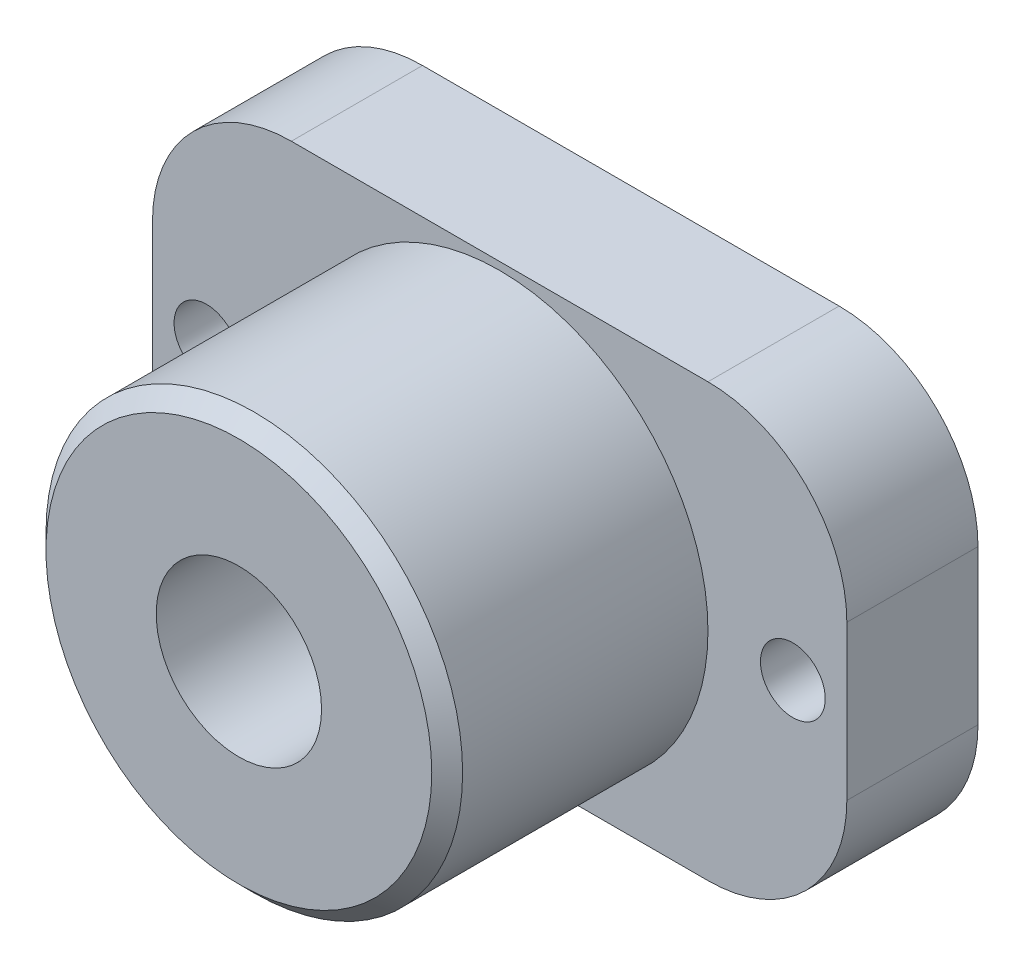
ISO-10303-21;
HEADER;
FILE_DESCRIPTION(('STEP AP214'),'2;1');
FILE_NAME('part.step','',(''),(''),'','','');
FILE_SCHEMA(('AUTOMOTIVE_DESIGN { 1 0 10303 214 1 1 1 1 }'));
ENDSEC;
DATA;
#1=APPLICATION_CONTEXT('core data for automotive mechanical design processes');
#2=APPLICATION_PROTOCOL_DEFINITION('international standard','automotive_design',2000,#1);
#3=PRODUCT_CONTEXT('',#1,'mechanical');
#4=PRODUCT('Part','Part','',(#3));
#5=PRODUCT_RELATED_PRODUCT_CATEGORY('part','',(#4));
#6=PRODUCT_DEFINITION_FORMATION('','',#4);
#7=PRODUCT_DEFINITION_CONTEXT('part definition',#1,'design');
#8=PRODUCT_DEFINITION('design','',#6,#7);
#9=PRODUCT_DEFINITION_SHAPE('','',#8);
#10=(LENGTH_UNIT() NAMED_UNIT(*) SI_UNIT(.MILLI.,.METRE.));
#11=(NAMED_UNIT(*) PLANE_ANGLE_UNIT() SI_UNIT($,.RADIAN.));
#12=(NAMED_UNIT(*) SI_UNIT($,.STERADIAN.) SOLID_ANGLE_UNIT());
#13=UNCERTAINTY_MEASURE_WITH_UNIT(LENGTH_MEASURE(1.E-05),#10,'distance_accuracy_value','');
#14=(GEOMETRIC_REPRESENTATION_CONTEXT(3) GLOBAL_UNCERTAINTY_ASSIGNED_CONTEXT((#13)) GLOBAL_UNIT_ASSIGNED_CONTEXT((#10,
#11,#12)) REPRESENTATION_CONTEXT('',''));
#15=CARTESIAN_POINT('',(0.,0.,0.));
#16=DIRECTION('',(0.,0.,1.));
#17=DIRECTION('',(1.,0.,0.));
#18=AXIS2_PLACEMENT_3D('',#15,#16,#17);
#19=CARTESIAN_POINT('',(0.,0.,0.));
#20=DIRECTION('',(0.,0.,1.));
#21=DIRECTION('',(1.,0.,0.));
#22=AXIS2_PLACEMENT_3D('',#19,#20,#21);
#23=CYLINDRICAL_SURFACE('',#22,5.35813);
#24=CARTESIAN_POINT('',(0.,0.,0.));
#25=DIRECTION('',(0.,0.,1.));
#26=DIRECTION('',(1.,0.,0.));
#27=AXIS2_PLACEMENT_3D('',#24,#25,#26);
#28=CIRCLE('',#27,5.35813);
#29=CARTESIAN_POINT('',(5.35813,0.,0.));
#30=VERTEX_POINT('',#29);
#31=EDGE_CURVE('E128',#30,#30,#28,.T.);
#32=ORIENTED_EDGE('',*,*,#31,.T.);
#33=EDGE_LOOP('',(#32));
#34=FACE_BOUND('',#33,.T.);
#35=CARTESIAN_POINT('',(0.,0.,-13.4));
#36=DIRECTION('',(0.,0.,-1.));
#37=DIRECTION('',(-1.,0.,0.));
#38=AXIS2_PLACEMENT_3D('',#35,#36,#37);
#39=CIRCLE('',#38,5.35813);
#40=CARTESIAN_POINT('',(-5.35813,0.,-13.4));
#41=VERTEX_POINT('',#40);
#42=EDGE_CURVE('E38',#41,#41,#39,.F.);
#43=ORIENTED_EDGE('',*,*,#42,.F.);
#44=EDGE_LOOP('',(#43));
#45=FACE_BOUND('',#44,.T.);
#46=ADVANCED_FACE('F34',(#34,#45),#23,.F.);
#47=CARTESIAN_POINT('',(0.,0.,0.));
#48=DIRECTION('',(0.,0.,1.));
#49=DIRECTION('',(1.,0.,0.));
#50=AXIS2_PLACEMENT_3D('',#47,#48,#49);
#51=PLANE('',#50);
#52=CARTESIAN_POINT('',(0.,0.,0.));
#53=DIRECTION('',(0.,0.,1.));
#54=DIRECTION('',(1.,0.,0.));
#55=AXIS2_PLACEMENT_3D('',#52,#53,#54);
#56=CIRCLE('',#55,12.5);
#57=CARTESIAN_POINT('',(12.5,0.,0.));
#58=VERTEX_POINT('',#57);
#59=EDGE_CURVE('E11',#58,#58,#56,.T.);
#60=ORIENTED_EDGE('',*,*,#59,.T.);
#61=EDGE_LOOP('',(#60));
#62=FACE_BOUND('',#61,.T.);
#63=ORIENTED_EDGE('',*,*,#31,.F.);
#64=EDGE_LOOP('',(#63));
#65=FACE_BOUND('',#64,.T.);
#66=ADVANCED_FACE('F176',(#62,#65),#51,.T.);
#67=CARTESIAN_POINT('',(0.,0.,0.));
#68=DIRECTION('',(0.,0.,-1.));
#69=DIRECTION('',(-1.,0.,0.));
#70=AXIS2_PLACEMENT_3D('',#67,#68,#69);
#71=CYLINDRICAL_SURFACE('',#70,13.5);
#72=CARTESIAN_POINT('',(0.,0.,-1.00000000000001));
#73=DIRECTION('',(0.,0.,1.));
#74=DIRECTION('',(1.,0.,0.));
#75=AXIS2_PLACEMENT_3D('',#72,#73,#74);
#76=CIRCLE('',#75,13.5);
#77=CARTESIAN_POINT('',(13.5,0.,-1.00000000000001));
#78=VERTEX_POINT('',#77);
#79=EDGE_CURVE('E43',#78,#78,#76,.F.);
#80=ORIENTED_EDGE('',*,*,#79,.T.);
#81=EDGE_LOOP('',(#80));
#82=FACE_BOUND('',#81,.T.);
#83=CARTESIAN_POINT('',(0.,0.,-16.9));
#84=DIRECTION('',(0.,0.,-1.));
#85=DIRECTION('',(-1.,0.,0.));
#86=AXIS2_PLACEMENT_3D('',#83,#84,#85);
#87=CIRCLE('',#86,13.5);
#88=CARTESIAN_POINT('',(-13.5,0.,-16.9));
#89=VERTEX_POINT('',#88);
#90=EDGE_CURVE('E124',#89,#89,#87,.T.);
#91=ORIENTED_EDGE('',*,*,#90,.F.);
#92=EDGE_LOOP('',(#91));
#93=FACE_BOUND('',#92,.T.);
#94=ADVANCED_FACE('F159',(#82,#93),#71,.T.);
#95=CARTESIAN_POINT('',(0.,13.5,-16.9));
#96=DIRECTION('',(0.,0.,1.));
#97=DIRECTION('',(1.,0.,0.));
#98=AXIS2_PLACEMENT_3D('',#95,#96,#97);
#99=PLANE('',#98);
#100=CARTESIAN_POINT('',(-19.,0.,-16.9));
#101=DIRECTION('',(0.,0.,1.));
#102=DIRECTION('',(1.,0.,0.));
#103=AXIS2_PLACEMENT_3D('',#100,#101,#102);
#104=CIRCLE('',#103,2.1);
#105=CARTESIAN_POINT('',(-16.9,0.,-16.9));
#106=VERTEX_POINT('',#105);
#107=EDGE_CURVE('E324',#106,#106,#104,.T.);
#108=ORIENTED_EDGE('',*,*,#107,.F.);
#109=EDGE_LOOP('',(#108));
#110=FACE_BOUND('',#109,.T.);
#111=CARTESIAN_POINT('',(19.,0.,-16.9));
#112=DIRECTION('',(0.,0.,1.));
#113=DIRECTION('',(1.,0.,0.));
#114=AXIS2_PLACEMENT_3D('',#111,#112,#113);
#115=CIRCLE('',#114,2.1);
#116=CARTESIAN_POINT('',(21.1,0.,-16.9));
#117=VERTEX_POINT('',#116);
#118=EDGE_CURVE('E318',#117,#117,#115,.T.);
#119=ORIENTED_EDGE('',*,*,#118,.F.);
#120=EDGE_LOOP('',(#119));
#121=FACE_BOUND('',#120,.T.);
#122=ORIENTED_EDGE('',*,*,#90,.T.);
#123=EDGE_LOOP('',(#122));
#124=FACE_BOUND('',#123,.T.);
#125=DIRECTION('',(1.,0.,0.));
#126=VECTOR('',#125,1.);
#127=CARTESIAN_POINT('',(22.5,-14.,-16.9));
#128=LINE('',#127,#126);
#129=CARTESIAN_POINT('',(-13.5,-14.,-16.9));
#130=VERTEX_POINT('',#129);
#131=CARTESIAN_POINT('',(13.5,-14.,-16.9));
#132=VERTEX_POINT('',#131);
#133=EDGE_CURVE('E105',#130,#132,#128,.T.);
#134=ORIENTED_EDGE('',*,*,#133,.T.);
#135=CARTESIAN_POINT('',(13.5,-4.99999999999999,-16.9));
#136=DIRECTION('',(0.,0.,1.));
#137=DIRECTION('',(1.,0.,0.));
#138=AXIS2_PLACEMENT_3D('',#135,#136,#137);
#139=CIRCLE('',#138,9.);
#140=CARTESIAN_POINT('',(22.5,-4.99999999999999,-16.9));
#141=VERTEX_POINT('',#140);
#142=EDGE_CURVE('E134',#132,#141,#139,.T.);
#143=ORIENTED_EDGE('',*,*,#142,.T.);
#144=DIRECTION('',(0.,1.,0.));
#145=VECTOR('',#144,1.);
#146=CARTESIAN_POINT('',(22.5,-14.,-16.9));
#147=LINE('',#146,#145);
#148=CARTESIAN_POINT('',(22.5,4.99999999999999,-16.9));
#149=VERTEX_POINT('',#148);
#150=EDGE_CURVE('E121',#141,#149,#147,.T.);
#151=ORIENTED_EDGE('',*,*,#150,.T.);
#152=CARTESIAN_POINT('',(13.5,5.,-16.9));
#153=DIRECTION('',(0.,0.,1.));
#154=DIRECTION('',(1.,0.,0.));
#155=AXIS2_PLACEMENT_3D('',#152,#153,#154);
#156=CIRCLE('',#155,9.);
#157=CARTESIAN_POINT('',(13.5,14.,-16.9));
#158=VERTEX_POINT('',#157);
#159=EDGE_CURVE('E111',#149,#158,#156,.T.);
#160=ORIENTED_EDGE('',*,*,#159,.T.);
#161=DIRECTION('',(-1.,0.,0.));
#162=VECTOR('',#161,1.);
#163=CARTESIAN_POINT('',(22.5,14.,-16.9));
#164=LINE('',#163,#162);
#165=CARTESIAN_POINT('',(-13.5,14.,-16.9));
#166=VERTEX_POINT('',#165);
#167=EDGE_CURVE('E288',#158,#166,#164,.T.);
#168=ORIENTED_EDGE('',*,*,#167,.T.);
#169=CARTESIAN_POINT('',(-13.5,5.,-16.9));
#170=DIRECTION('',(0.,0.,1.));
#171=DIRECTION('',(1.,0.,0.));
#172=AXIS2_PLACEMENT_3D('',#169,#170,#171);
#173=CIRCLE('',#172,9.);
#174=CARTESIAN_POINT('',(-22.5,4.99999999999999,-16.9));
#175=VERTEX_POINT('',#174);
#176=EDGE_CURVE('E112',#166,#175,#173,.T.);
#177=ORIENTED_EDGE('',*,*,#176,.T.);
#178=DIRECTION('',(0.,-1.,0.));
#179=VECTOR('',#178,1.);
#180=CARTESIAN_POINT('',(-22.5,-14.,-16.9));
#181=LINE('',#180,#179);
#182=CARTESIAN_POINT('',(-22.5,-4.99999999999999,-16.9));
#183=VERTEX_POINT('',#182);
#184=EDGE_CURVE('E106',#175,#183,#181,.T.);
#185=ORIENTED_EDGE('',*,*,#184,.T.);
#186=CARTESIAN_POINT('',(-13.5,-4.99999999999999,-16.9));
#187=DIRECTION('',(0.,0.,1.));
#188=DIRECTION('',(1.,0.,0.));
#189=AXIS2_PLACEMENT_3D('',#186,#187,#188);
#190=CIRCLE('',#189,9.);
#191=EDGE_CURVE('E102',#183,#130,#190,.T.);
#192=ORIENTED_EDGE('',*,*,#191,.T.);
#193=EDGE_LOOP('',(#134,#143,#151,#160,#168,#177,#185,#192));
#194=FACE_BOUND('',#193,.T.);
#195=ADVANCED_FACE('F104',(#110,#121,#124,#194),#99,.T.);
#196=CARTESIAN_POINT('',(0.,14.,-25.4));
#197=DIRECTION('',(0.,0.,-1.));
#198=DIRECTION('',(-1.,0.,0.));
#199=AXIS2_PLACEMENT_3D('',#196,#197,#198);
#200=PLANE('',#199);
#201=CARTESIAN_POINT('',(0.,0.,-25.4));
#202=DIRECTION('',(0.,0.,-1.));
#203=DIRECTION('',(-1.,0.,0.));
#204=AXIS2_PLACEMENT_3D('',#201,#202,#203);
#205=CIRCLE('',#204,11.5);
#206=CARTESIAN_POINT('',(-11.5,0.,-25.4));
#207=VERTEX_POINT('',#206);
#208=EDGE_CURVE('E327',#207,#207,#205,.T.);
#209=ORIENTED_EDGE('',*,*,#208,.F.);
#210=EDGE_LOOP('',(#209));
#211=FACE_BOUND('',#210,.T.);
#212=CARTESIAN_POINT('',(-19.,0.,-25.4));
#213=DIRECTION('',(0.,0.,1.));
#214=DIRECTION('',(1.,0.,0.));
#215=AXIS2_PLACEMENT_3D('',#212,#213,#214);
#216=CIRCLE('',#215,2.1);
#217=CARTESIAN_POINT('',(-16.9,0.,-25.4));
#218=VERTEX_POINT('',#217);
#219=EDGE_CURVE('E321',#218,#218,#216,.T.);
#220=ORIENTED_EDGE('',*,*,#219,.T.);
#221=EDGE_LOOP('',(#220));
#222=FACE_BOUND('',#221,.T.);
#223=CARTESIAN_POINT('',(19.,0.,-25.4));
#224=DIRECTION('',(0.,0.,1.));
#225=DIRECTION('',(1.,0.,0.));
#226=AXIS2_PLACEMENT_3D('',#223,#224,#225);
#227=CIRCLE('',#226,2.1);
#228=CARTESIAN_POINT('',(21.1,0.,-25.4));
#229=VERTEX_POINT('',#228);
#230=EDGE_CURVE('E312',#229,#229,#227,.T.);
#231=ORIENTED_EDGE('',*,*,#230,.T.);
#232=EDGE_LOOP('',(#231));
#233=FACE_BOUND('',#232,.T.);
#234=DIRECTION('',(0.,1.,0.));
#235=VECTOR('',#234,1.);
#236=CARTESIAN_POINT('',(22.5,-14.,-25.4));
#237=LINE('',#236,#235);
#238=CARTESIAN_POINT('',(22.5,-4.99999999999999,-25.4));
#239=VERTEX_POINT('',#238);
#240=CARTESIAN_POINT('',(22.5,4.99999999999999,-25.4));
#241=VERTEX_POINT('',#240);
#242=EDGE_CURVE('E298',#239,#241,#237,.T.);
#243=ORIENTED_EDGE('',*,*,#242,.F.);
#244=CARTESIAN_POINT('',(13.5,-4.99999999999999,-25.4));
#245=DIRECTION('',(0.,0.,-1.));
#246=DIRECTION('',(-1.,0.,0.));
#247=AXIS2_PLACEMENT_3D('',#244,#245,#246);
#248=CIRCLE('',#247,9.);
#249=CARTESIAN_POINT('',(13.5,-14.,-25.4));
#250=VERTEX_POINT('',#249);
#251=EDGE_CURVE('E146',#239,#250,#248,.T.);
#252=ORIENTED_EDGE('',*,*,#251,.T.);
#253=DIRECTION('',(1.,0.,0.));
#254=VECTOR('',#253,1.);
#255=CARTESIAN_POINT('',(22.5,-14.,-25.4));
#256=LINE('',#255,#254);
#257=CARTESIAN_POINT('',(-13.5,-14.,-25.4));
#258=VERTEX_POINT('',#257);
#259=EDGE_CURVE('E304',#258,#250,#256,.T.);
#260=ORIENTED_EDGE('',*,*,#259,.F.);
#261=CARTESIAN_POINT('',(-13.5,-4.99999999999999,-25.4));
#262=DIRECTION('',(0.,0.,-1.));
#263=DIRECTION('',(-1.,0.,0.));
#264=AXIS2_PLACEMENT_3D('',#261,#262,#263);
#265=CIRCLE('',#264,9.);
#266=CARTESIAN_POINT('',(-22.5,-4.99999999999999,-25.4));
#267=VERTEX_POINT('',#266);
#268=EDGE_CURVE('E50',#258,#267,#265,.T.);
#269=ORIENTED_EDGE('',*,*,#268,.T.);
#270=DIRECTION('',(0.,-1.,0.));
#271=VECTOR('',#270,1.);
#272=CARTESIAN_POINT('',(-22.5,-14.,-25.4));
#273=LINE('',#272,#271);
#274=CARTESIAN_POINT('',(-22.5,4.99999999999999,-25.4));
#275=VERTEX_POINT('',#274);
#276=EDGE_CURVE('E307',#275,#267,#273,.T.);
#277=ORIENTED_EDGE('',*,*,#276,.F.);
#278=CARTESIAN_POINT('',(-13.5,5.,-25.4));
#279=DIRECTION('',(0.,0.,-1.));
#280=DIRECTION('',(-1.,0.,0.));
#281=AXIS2_PLACEMENT_3D('',#278,#279,#280);
#282=CIRCLE('',#281,9.);
#283=CARTESIAN_POINT('',(-13.5,14.,-25.4));
#284=VERTEX_POINT('',#283);
#285=EDGE_CURVE('E141',#275,#284,#282,.T.);
#286=ORIENTED_EDGE('',*,*,#285,.T.);
#287=DIRECTION('',(-1.,0.,0.));
#288=VECTOR('',#287,1.);
#289=CARTESIAN_POINT('',(22.5,14.,-25.4));
#290=LINE('',#289,#288);
#291=CARTESIAN_POINT('',(13.5,14.,-25.4));
#292=VERTEX_POINT('',#291);
#293=EDGE_CURVE('E300',#292,#284,#290,.T.);
#294=ORIENTED_EDGE('',*,*,#293,.F.);
#295=CARTESIAN_POINT('',(13.5,5.,-25.4));
#296=DIRECTION('',(0.,0.,-1.));
#297=DIRECTION('',(-1.,0.,0.));
#298=AXIS2_PLACEMENT_3D('',#295,#296,#297);
#299=CIRCLE('',#298,9.);
#300=EDGE_CURVE('E144',#292,#241,#299,.T.);
#301=ORIENTED_EDGE('',*,*,#300,.T.);
#302=EDGE_LOOP('',(#243,#252,#260,#269,#277,#286,#294,#301));
#303=FACE_BOUND('',#302,.T.);
#304=ADVANCED_FACE('F190',(#211,#222,#233,#303),#200,.T.);
#305=CARTESIAN_POINT('',(22.5,14.,-78.4));
#306=DIRECTION('',(0.,1.,0.));
#307=DIRECTION('',(0.,0.,1.));
#308=AXIS2_PLACEMENT_3D('',#305,#306,#307);
#309=PLANE('',#308);
#310=ORIENTED_EDGE('',*,*,#167,.F.);
#311=DIRECTION('',(0.,0.,1.));
#312=VECTOR('',#311,1.);
#313=CARTESIAN_POINT('',(13.5,14.,-78.4));
#314=LINE('',#313,#312);
#315=EDGE_CURVE('E151',#158,#292,#314,.F.);
#316=ORIENTED_EDGE('',*,*,#315,.T.);
#317=ORIENTED_EDGE('',*,*,#293,.T.);
#318=DIRECTION('',(0.,0.,1.));
#319=VECTOR('',#318,1.);
#320=CARTESIAN_POINT('',(-13.5,14.,-78.4));
#321=LINE('',#320,#319);
#322=EDGE_CURVE('E148',#284,#166,#321,.T.);
#323=ORIENTED_EDGE('',*,*,#322,.T.);
#324=EDGE_LOOP('',(#310,#316,#317,#323));
#325=FACE_BOUND('',#324,.T.);
#326=ADVANCED_FACE('F193',(#325),#309,.T.);
#327=CARTESIAN_POINT('',(22.5,-14.,-78.4));
#328=DIRECTION('',(0.,-1.,0.));
#329=DIRECTION('',(0.,0.,-1.));
#330=AXIS2_PLACEMENT_3D('',#327,#328,#329);
#331=PLANE('',#330);
#332=ORIENTED_EDGE('',*,*,#259,.T.);
#333=DIRECTION('',(0.,0.,1.));
#334=VECTOR('',#333,1.);
#335=CARTESIAN_POINT('',(13.5,-14.,-78.4));
#336=LINE('',#335,#334);
#337=EDGE_CURVE('E120',#250,#132,#336,.T.);
#338=ORIENTED_EDGE('',*,*,#337,.T.);
#339=ORIENTED_EDGE('',*,*,#133,.F.);
#340=DIRECTION('',(0.,0.,1.));
#341=VECTOR('',#340,1.);
#342=CARTESIAN_POINT('',(-13.5,-14.,-78.4));
#343=LINE('',#342,#341);
#344=EDGE_CURVE('E118',#130,#258,#343,.F.);
#345=ORIENTED_EDGE('',*,*,#344,.T.);
#346=EDGE_LOOP('',(#332,#338,#339,#345));
#347=FACE_BOUND('',#346,.T.);
#348=ADVANCED_FACE('F117',(#347),#331,.T.);
#349=CARTESIAN_POINT('',(-22.5,-14.,-78.4));
#350=DIRECTION('',(-1.,0.,0.));
#351=DIRECTION('',(0.,-1.,0.));
#352=AXIS2_PLACEMENT_3D('',#349,#350,#351);
#353=PLANE('',#352);
#354=ORIENTED_EDGE('',*,*,#276,.T.);
#355=DIRECTION('',(0.,0.,1.));
#356=VECTOR('',#355,1.);
#357=CARTESIAN_POINT('',(-22.5,-4.99999999999999,-78.4));
#358=LINE('',#357,#356);
#359=EDGE_CURVE('E154',#267,#183,#358,.T.);
#360=ORIENTED_EDGE('',*,*,#359,.T.);
#361=ORIENTED_EDGE('',*,*,#184,.F.);
#362=DIRECTION('',(0.,0.,1.));
#363=VECTOR('',#362,1.);
#364=CARTESIAN_POINT('',(-22.5,4.99999999999999,-78.4));
#365=LINE('',#364,#363);
#366=EDGE_CURVE('E57',#175,#275,#365,.F.);
#367=ORIENTED_EDGE('',*,*,#366,.T.);
#368=EDGE_LOOP('',(#354,#360,#361,#367));
#369=FACE_BOUND('',#368,.T.);
#370=ADVANCED_FACE('F188',(#369),#353,.T.);
#371=CARTESIAN_POINT('',(22.5,-14.,-78.4));
#372=DIRECTION('',(1.,0.,0.));
#373=DIRECTION('',(0.,1.,0.));
#374=AXIS2_PLACEMENT_3D('',#371,#372,#373);
#375=PLANE('',#374);
#376=ORIENTED_EDGE('',*,*,#150,.F.);
#377=DIRECTION('',(0.,0.,1.));
#378=VECTOR('',#377,1.);
#379=CARTESIAN_POINT('',(22.5,-4.99999999999999,-78.4));
#380=LINE('',#379,#378);
#381=EDGE_CURVE('E139',#141,#239,#380,.F.);
#382=ORIENTED_EDGE('',*,*,#381,.T.);
#383=ORIENTED_EDGE('',*,*,#242,.T.);
#384=DIRECTION('',(0.,0.,1.));
#385=VECTOR('',#384,1.);
#386=CARTESIAN_POINT('',(22.5,4.99999999999999,-78.4));
#387=LINE('',#386,#385);
#388=EDGE_CURVE('E136',#241,#149,#387,.T.);
#389=ORIENTED_EDGE('',*,*,#388,.T.);
#390=EDGE_LOOP('',(#376,#382,#383,#389));
#391=FACE_BOUND('',#390,.T.);
#392=ADVANCED_FACE('F277',(#391),#375,.T.);
#393=CARTESIAN_POINT('',(19.,0.,-16.9));
#394=DIRECTION('',(0.,0.,1.));
#395=DIRECTION('',(1.,0.,0.));
#396=AXIS2_PLACEMENT_3D('',#393,#394,#395);
#397=CYLINDRICAL_SURFACE('',#396,2.1);
#398=ORIENTED_EDGE('',*,*,#230,.F.);
#399=EDGE_LOOP('',(#398));
#400=FACE_BOUND('',#399,.T.);
#401=ORIENTED_EDGE('',*,*,#118,.T.);
#402=EDGE_LOOP('',(#401));
#403=FACE_BOUND('',#402,.T.);
#404=ADVANCED_FACE('F273',(#400,#403),#397,.F.);
#405=CARTESIAN_POINT('',(-19.,0.,-16.9));
#406=DIRECTION('',(0.,0.,1.));
#407=DIRECTION('',(1.,0.,0.));
#408=AXIS2_PLACEMENT_3D('',#405,#406,#407);
#409=CYLINDRICAL_SURFACE('',#408,2.1);
#410=ORIENTED_EDGE('',*,*,#219,.F.);
#411=EDGE_LOOP('',(#410));
#412=FACE_BOUND('',#411,.T.);
#413=ORIENTED_EDGE('',*,*,#107,.T.);
#414=EDGE_LOOP('',(#413));
#415=FACE_BOUND('',#414,.T.);
#416=ADVANCED_FACE('F204',(#412,#415),#409,.F.);
#417=CARTESIAN_POINT('',(13.5,-4.99999999999999,-78.4));
#418=DIRECTION('',(0.,0.,1.));
#419=DIRECTION('',(1.,0.,0.));
#420=AXIS2_PLACEMENT_3D('',#417,#418,#419);
#421=CYLINDRICAL_SURFACE('',#420,9.);
#422=ORIENTED_EDGE('',*,*,#251,.F.);
#423=ORIENTED_EDGE('',*,*,#381,.F.);
#424=ORIENTED_EDGE('',*,*,#142,.F.);
#425=ORIENTED_EDGE('',*,*,#337,.F.);
#426=EDGE_LOOP('',(#422,#423,#424,#425));
#427=FACE_BOUND('',#426,.T.);
#428=ADVANCED_FACE('F200',(#427),#421,.T.);
#429=CARTESIAN_POINT('',(13.5,5.,-78.4));
#430=DIRECTION('',(0.,0.,1.));
#431=DIRECTION('',(1.,0.,0.));
#432=AXIS2_PLACEMENT_3D('',#429,#430,#431);
#433=CYLINDRICAL_SURFACE('',#432,9.);
#434=ORIENTED_EDGE('',*,*,#300,.F.);
#435=ORIENTED_EDGE('',*,*,#315,.F.);
#436=ORIENTED_EDGE('',*,*,#159,.F.);
#437=ORIENTED_EDGE('',*,*,#388,.F.);
#438=EDGE_LOOP('',(#434,#435,#436,#437));
#439=FACE_BOUND('',#438,.T.);
#440=ADVANCED_FACE('F203',(#439),#433,.T.);
#441=CARTESIAN_POINT('',(-13.5,-4.99999999999999,-78.4));
#442=DIRECTION('',(0.,0.,1.));
#443=DIRECTION('',(1.,0.,0.));
#444=AXIS2_PLACEMENT_3D('',#441,#442,#443);
#445=CYLINDRICAL_SURFACE('',#444,9.);
#446=ORIENTED_EDGE('',*,*,#268,.F.);
#447=ORIENTED_EDGE('',*,*,#344,.F.);
#448=ORIENTED_EDGE('',*,*,#191,.F.);
#449=ORIENTED_EDGE('',*,*,#359,.F.);
#450=EDGE_LOOP('',(#446,#447,#448,#449));
#451=FACE_BOUND('',#450,.T.);
#452=ADVANCED_FACE('F123',(#451),#445,.T.);
#453=CARTESIAN_POINT('',(-13.5,5.,-78.4));
#454=DIRECTION('',(0.,0.,1.));
#455=DIRECTION('',(1.,0.,0.));
#456=AXIS2_PLACEMENT_3D('',#453,#454,#455);
#457=CYLINDRICAL_SURFACE('',#456,9.);
#458=ORIENTED_EDGE('',*,*,#285,.F.);
#459=ORIENTED_EDGE('',*,*,#366,.F.);
#460=ORIENTED_EDGE('',*,*,#176,.F.);
#461=ORIENTED_EDGE('',*,*,#322,.F.);
#462=EDGE_LOOP('',(#458,#459,#460,#461));
#463=FACE_BOUND('',#462,.T.);
#464=ADVANCED_FACE('F164',(#463),#457,.T.);
#465=CARTESIAN_POINT('',(0.,0.,-1.00000000000001));
#466=DIRECTION('',(0.,0.,-1.));
#467=DIRECTION('',(-1.,0.,0.));
#468=AXIS2_PLACEMENT_3D('',#465,#466,#467);
#469=CONICAL_SURFACE('',#468,13.5,0.785398163397449);
#470=ORIENTED_EDGE('',*,*,#59,.F.);
#471=EDGE_LOOP('',(#470));
#472=FACE_BOUND('',#471,.T.);
#473=ORIENTED_EDGE('',*,*,#79,.F.);
#474=EDGE_LOOP('',(#473));
#475=FACE_BOUND('',#474,.T.);
#476=ADVANCED_FACE('F36',(#472,#475),#469,.T.);
#477=CARTESIAN_POINT('',(0.,0.,-13.4));
#478=DIRECTION('',(0.,0.,-1.));
#479=DIRECTION('',(-1.,0.,0.));
#480=AXIS2_PLACEMENT_3D('',#477,#478,#479);
#481=PLANE('',#480);
#482=CARTESIAN_POINT('',(0.,0.,-13.4));
#483=DIRECTION('',(0.,0.,-1.));
#484=DIRECTION('',(-1.,0.,0.));
#485=AXIS2_PLACEMENT_3D('',#482,#483,#484);
#486=CIRCLE('',#485,11.5);
#487=CARTESIAN_POINT('',(-11.5,0.,-13.4));
#488=VERTEX_POINT('',#487);
#489=EDGE_CURVE('E330',#488,#488,#486,.T.);
#490=ORIENTED_EDGE('',*,*,#489,.T.);
#491=EDGE_LOOP('',(#490));
#492=FACE_BOUND('',#491,.T.);
#493=ORIENTED_EDGE('',*,*,#42,.T.);
#494=EDGE_LOOP('',(#493));
#495=FACE_BOUND('',#494,.T.);
#496=ADVANCED_FACE('F163',(#492,#495),#481,.T.);
#497=CARTESIAN_POINT('',(0.,0.,-13.4));
#498=DIRECTION('',(0.,0.,-1.));
#499=DIRECTION('',(-1.,0.,0.));
#500=AXIS2_PLACEMENT_3D('',#497,#498,#499);
#501=CYLINDRICAL_SURFACE('',#500,11.5);
#502=ORIENTED_EDGE('',*,*,#489,.F.);
#503=EDGE_LOOP('',(#502));
#504=FACE_BOUND('',#503,.T.);
#505=ORIENTED_EDGE('',*,*,#208,.T.);
#506=EDGE_LOOP('',(#505));
#507=FACE_BOUND('',#506,.T.);
#508=ADVANCED_FACE('F170',(#504,#507),#501,.F.);
#509=CLOSED_SHELL('',(#46,#66,#94,#195,#304,#326,#348,#370,#392,#404,#416,#428,#440,#452,#464,
#476,#496,#508));
#510=MANIFOLD_SOLID_BREP('B2',#509);
#511=ADVANCED_BREP_SHAPE_REPRESENTATION('',(#18,#510),#14);
#512=SHAPE_DEFINITION_REPRESENTATION(#9,#511);
ENDSEC;
END-ISO-10303-21;
